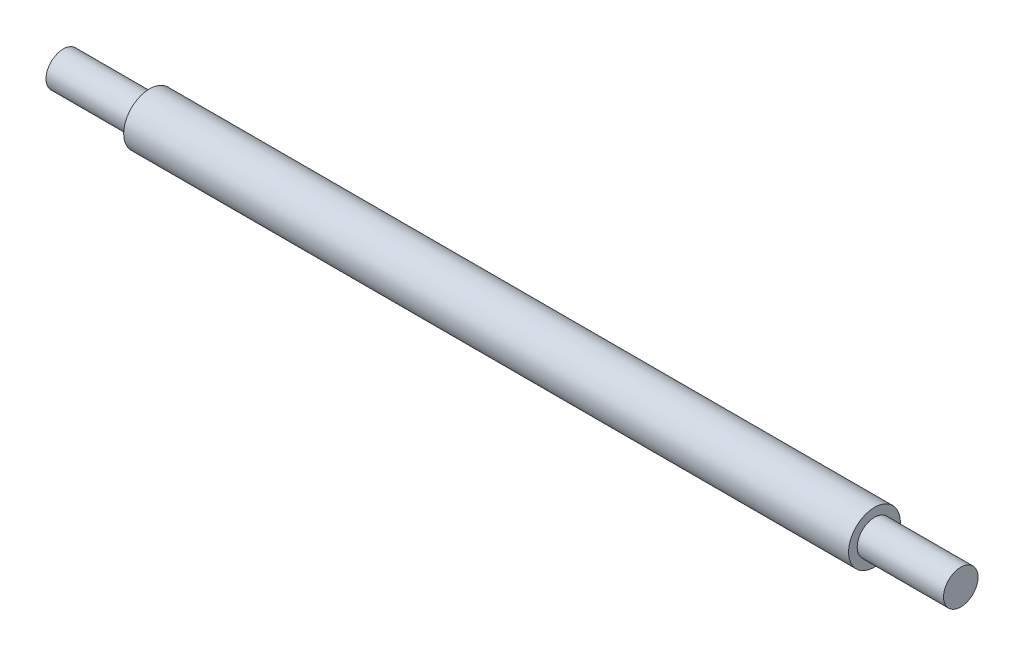
ISO-10303-21;
HEADER;
FILE_DESCRIPTION(('STEP AP214'),'2;1');
FILE_NAME('part.step','',(''),(''),'','','');
FILE_SCHEMA(('AUTOMOTIVE_DESIGN { 1 0 10303 214 1 1 1 1 }'));
ENDSEC;
DATA;
#1=APPLICATION_CONTEXT('core data for automotive mechanical design processes');
#2=APPLICATION_PROTOCOL_DEFINITION('international standard','automotive_design',2000,#1);
#3=PRODUCT_CONTEXT('',#1,'mechanical');
#4=PRODUCT('Part','Part','',(#3));
#5=PRODUCT_RELATED_PRODUCT_CATEGORY('part','',(#4));
#6=PRODUCT_DEFINITION_FORMATION('','',#4);
#7=PRODUCT_DEFINITION_CONTEXT('part definition',#1,'design');
#8=PRODUCT_DEFINITION('design','',#6,#7);
#9=PRODUCT_DEFINITION_SHAPE('','',#8);
#10=(LENGTH_UNIT() NAMED_UNIT(*) SI_UNIT(.MILLI.,.METRE.));
#11=(NAMED_UNIT(*) PLANE_ANGLE_UNIT() SI_UNIT($,.RADIAN.));
#12=(NAMED_UNIT(*) SI_UNIT($,.STERADIAN.) SOLID_ANGLE_UNIT());
#13=UNCERTAINTY_MEASURE_WITH_UNIT(LENGTH_MEASURE(1.E-05),#10,'distance_accuracy_value','');
#14=(GEOMETRIC_REPRESENTATION_CONTEXT(3) GLOBAL_UNCERTAINTY_ASSIGNED_CONTEXT((#13)) GLOBAL_UNIT_ASSIGNED_CONTEXT((#10,
#11,#12)) REPRESENTATION_CONTEXT('',''));
#15=CARTESIAN_POINT('',(0.,0.,0.));
#16=DIRECTION('',(0.,0.,1.));
#17=DIRECTION('',(1.,0.,0.));
#18=AXIS2_PLACEMENT_3D('',#15,#16,#17);
#19=CARTESIAN_POINT('',(0.,0.,0.));
#20=DIRECTION('',(1.,0.,0.));
#21=DIRECTION('',(0.,0.,-1.));
#22=AXIS2_PLACEMENT_3D('',#19,#20,#21);
#23=PLANE('',#22);
#24=CARTESIAN_POINT('',(0.,0.,0.));
#25=DIRECTION('',(-1.,0.,0.));
#26=DIRECTION('',(0.,0.,1.));
#27=AXIS2_PLACEMENT_3D('',#24,#25,#26);
#28=CIRCLE('',#27,2.);
#29=CARTESIAN_POINT('',(0.,0.,2.));
#30=VERTEX_POINT('',#29);
#31=EDGE_CURVE('E10',#30,#30,#28,.T.);
#32=ORIENTED_EDGE('',*,*,#31,.T.);
#33=EDGE_LOOP('',(#32));
#34=FACE_BOUND('',#33,.T.);
#35=ADVANCED_FACE('F40',(#34),#23,.F.);
#36=CARTESIAN_POINT('',(0.,0.,0.));
#37=DIRECTION('',(-1.,0.,0.));
#38=DIRECTION('',(0.,0.,1.));
#39=AXIS2_PLACEMENT_3D('',#36,#37,#38);
#40=CYLINDRICAL_SURFACE('',#39,2.);
#41=ORIENTED_EDGE('',*,*,#31,.F.);
#42=EDGE_LOOP('',(#41));
#43=FACE_BOUND('',#42,.T.);
#44=CARTESIAN_POINT('',(10.,0.,0.));
#45=DIRECTION('',(-1.,0.,0.));
#46=DIRECTION('',(0.,0.,1.));
#47=AXIS2_PLACEMENT_3D('',#44,#45,#46);
#48=CIRCLE('',#47,2.);
#49=CARTESIAN_POINT('',(10.,0.,2.));
#50=VERTEX_POINT('',#49);
#51=EDGE_CURVE('E46',#50,#50,#48,.T.);
#52=ORIENTED_EDGE('',*,*,#51,.T.);
#53=EDGE_LOOP('',(#52));
#54=FACE_BOUND('',#53,.T.);
#55=ADVANCED_FACE('F78',(#43,#54),#40,.T.);
#56=CARTESIAN_POINT('',(10.,2.,0.));
#57=DIRECTION('',(1.,0.,0.));
#58=DIRECTION('',(0.,0.,-1.));
#59=AXIS2_PLACEMENT_3D('',#56,#57,#58);
#60=PLANE('',#59);
#61=ORIENTED_EDGE('',*,*,#51,.F.);
#62=EDGE_LOOP('',(#61));
#63=FACE_BOUND('',#62,.T.);
#64=CARTESIAN_POINT('',(10.,0.,0.));
#65=DIRECTION('',(-1.,0.,0.));
#66=DIRECTION('',(0.,0.,1.));
#67=AXIS2_PLACEMENT_3D('',#64,#65,#66);
#68=CIRCLE('',#67,3.);
#69=CARTESIAN_POINT('',(10.,0.,3.));
#70=VERTEX_POINT('',#69);
#71=EDGE_CURVE('E50',#70,#70,#68,.T.);
#72=ORIENTED_EDGE('',*,*,#71,.T.);
#73=EDGE_LOOP('',(#72));
#74=FACE_BOUND('',#73,.T.);
#75=ADVANCED_FACE('F82',(#63,#74),#60,.F.);
#76=CARTESIAN_POINT('',(0.,0.,0.));
#77=DIRECTION('',(-1.,0.,0.));
#78=DIRECTION('',(0.,0.,1.));
#79=AXIS2_PLACEMENT_3D('',#76,#77,#78);
#80=CYLINDRICAL_SURFACE('',#79,3.);
#81=ORIENTED_EDGE('',*,*,#71,.F.);
#82=EDGE_LOOP('',(#81));
#83=FACE_BOUND('',#82,.T.);
#84=CARTESIAN_POINT('',(94.,0.,0.));
#85=DIRECTION('',(-1.,0.,0.));
#86=DIRECTION('',(0.,0.,1.));
#87=AXIS2_PLACEMENT_3D('',#84,#85,#86);
#88=CIRCLE('',#87,3.);
#89=CARTESIAN_POINT('',(94.,0.,3.));
#90=VERTEX_POINT('',#89);
#91=EDGE_CURVE('E54',#90,#90,#88,.T.);
#92=ORIENTED_EDGE('',*,*,#91,.T.);
#93=EDGE_LOOP('',(#92));
#94=FACE_BOUND('',#93,.T.);
#95=ADVANCED_FACE('F87',(#83,#94),#80,.T.);
#96=CARTESIAN_POINT('',(94.,3.,0.));
#97=DIRECTION('',(-1.,0.,0.));
#98=DIRECTION('',(0.,0.,1.));
#99=AXIS2_PLACEMENT_3D('',#96,#97,#98);
#100=PLANE('',#99);
#101=ORIENTED_EDGE('',*,*,#91,.F.);
#102=EDGE_LOOP('',(#101));
#103=FACE_BOUND('',#102,.T.);
#104=CARTESIAN_POINT('',(94.,0.,0.));
#105=DIRECTION('',(-1.,0.,0.));
#106=DIRECTION('',(0.,0.,1.));
#107=AXIS2_PLACEMENT_3D('',#104,#105,#106);
#108=CIRCLE('',#107,2.);
#109=CARTESIAN_POINT('',(94.,0.,2.));
#110=VERTEX_POINT('',#109);
#111=EDGE_CURVE('E59',#110,#110,#108,.T.);
#112=ORIENTED_EDGE('',*,*,#111,.T.);
#113=EDGE_LOOP('',(#112));
#114=FACE_BOUND('',#113,.T.);
#115=ADVANCED_FACE('F74',(#103,#114),#100,.F.);
#116=CARTESIAN_POINT('',(0.,0.,0.));
#117=DIRECTION('',(-1.,0.,0.));
#118=DIRECTION('',(0.,0.,1.));
#119=AXIS2_PLACEMENT_3D('',#116,#117,#118);
#120=CYLINDRICAL_SURFACE('',#119,2.);
#121=ORIENTED_EDGE('',*,*,#111,.F.);
#122=EDGE_LOOP('',(#121));
#123=FACE_BOUND('',#122,.T.);
#124=CARTESIAN_POINT('',(104.,0.,0.));
#125=DIRECTION('',(-1.,0.,0.));
#126=DIRECTION('',(0.,0.,1.));
#127=AXIS2_PLACEMENT_3D('',#124,#125,#126);
#128=CIRCLE('',#127,2.);
#129=CARTESIAN_POINT('',(104.,0.,2.));
#130=VERTEX_POINT('',#129);
#131=EDGE_CURVE('E62',#130,#130,#128,.T.);
#132=ORIENTED_EDGE('',*,*,#131,.T.);
#133=EDGE_LOOP('',(#132));
#134=FACE_BOUND('',#133,.T.);
#135=ADVANCED_FACE('F66',(#123,#134),#120,.T.);
#136=CARTESIAN_POINT('',(104.,2.,0.));
#137=DIRECTION('',(-1.,0.,0.));
#138=DIRECTION('',(0.,0.,1.));
#139=AXIS2_PLACEMENT_3D('',#136,#137,#138);
#140=PLANE('',#139);
#141=ORIENTED_EDGE('',*,*,#131,.F.);
#142=EDGE_LOOP('',(#141));
#143=FACE_BOUND('',#142,.T.);
#144=ADVANCED_FACE('F68',(#143),#140,.F.);
#145=CLOSED_SHELL('',(#35,#55,#75,#95,#115,#135,#144));
#146=MANIFOLD_SOLID_BREP('B2',#145);
#147=ADVANCED_BREP_SHAPE_REPRESENTATION('',(#18,#146),#14);
#148=SHAPE_DEFINITION_REPRESENTATION(#9,#147);
ENDSEC;
END-ISO-10303-21;
